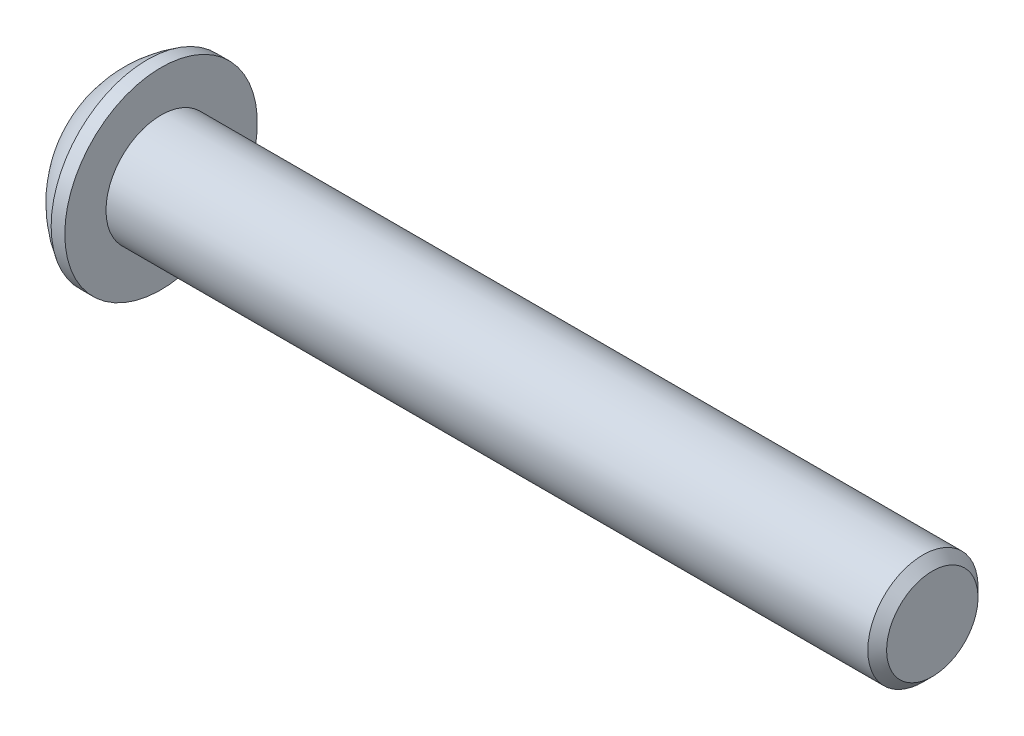
ISO-10303-21;
HEADER;
FILE_DESCRIPTION(('STEP AP214'),'2;1');
FILE_NAME('part.step','',(''),(''),'','','');
FILE_SCHEMA(('AUTOMOTIVE_DESIGN { 1 0 10303 214 1 1 1 1 }'));
ENDSEC;
DATA;
#1=APPLICATION_CONTEXT('core data for automotive mechanical design processes');
#2=APPLICATION_PROTOCOL_DEFINITION('international standard','automotive_design',2000,#1);
#3=PRODUCT_CONTEXT('',#1,'mechanical');
#4=PRODUCT('Part','Part','',(#3));
#5=PRODUCT_RELATED_PRODUCT_CATEGORY('part','',(#4));
#6=PRODUCT_DEFINITION_FORMATION('','',#4);
#7=PRODUCT_DEFINITION_CONTEXT('part definition',#1,'design');
#8=PRODUCT_DEFINITION('design','',#6,#7);
#9=PRODUCT_DEFINITION_SHAPE('','',#8);
#10=(LENGTH_UNIT() NAMED_UNIT(*) SI_UNIT(.MILLI.,.METRE.));
#11=(NAMED_UNIT(*) PLANE_ANGLE_UNIT() SI_UNIT($,.RADIAN.));
#12=(NAMED_UNIT(*) SI_UNIT($,.STERADIAN.) SOLID_ANGLE_UNIT());
#13=UNCERTAINTY_MEASURE_WITH_UNIT(LENGTH_MEASURE(1.E-05),#10,'distance_accuracy_value','');
#14=(GEOMETRIC_REPRESENTATION_CONTEXT(3) GLOBAL_UNCERTAINTY_ASSIGNED_CONTEXT((#13)) GLOBAL_UNIT_ASSIGNED_CONTEXT((#10,
#11,#12)) REPRESENTATION_CONTEXT('',''));
#15=CARTESIAN_POINT('',(0.,0.,0.));
#16=DIRECTION('',(0.,0.,1.));
#17=DIRECTION('',(1.,0.,0.));
#18=AXIS2_PLACEMENT_3D('',#15,#16,#17);
#19=CARTESIAN_POINT('',(0.,0.,0.));
#20=DIRECTION('',(-1.,0.,0.));
#21=DIRECTION('',(0.,0.,1.));
#22=AXIS2_PLACEMENT_3D('',#19,#20,#21);
#23=PLANE('',#22);
#24=CARTESIAN_POINT('',(0.,0.,0.));
#25=DIRECTION('',(-1.,0.,0.));
#26=DIRECTION('',(0.,0.,1.));
#27=AXIS2_PLACEMENT_3D('',#24,#25,#26);
#28=CIRCLE('',#27,2.77495);
#29=CARTESIAN_POINT('',(0.,2.77495,0.));
#30=VERTEX_POINT('',#29);
#31=EDGE_CURVE('E11',#30,#30,#28,.T.);
#32=ORIENTED_EDGE('',*,*,#31,.T.);
#33=EDGE_LOOP('',(#32));
#34=FACE_BOUND('',#33,.T.);
#35=DIRECTION('',(0.,-1.,0.));
#36=VECTOR('',#35,1.);
#37=CARTESIAN_POINT('',(0.,-1.14384635331849,1.9812));
#38=LINE('',#37,#36);
#39=CARTESIAN_POINT('',(0.,1.14384635331849,1.9812));
#40=VERTEX_POINT('',#39);
#41=CARTESIAN_POINT('',(0.,-1.14384635331849,1.9812));
#42=VERTEX_POINT('',#41);
#43=EDGE_CURVE('E46',#40,#42,#38,.T.);
#44=ORIENTED_EDGE('',*,*,#43,.T.);
#45=DIRECTION('',(0.,-0.5,-0.866025403784439));
#46=VECTOR('',#45,1.);
#47=CARTESIAN_POINT('',(0.,-2.28769270663697,0.));
#48=LINE('',#47,#46);
#49=CARTESIAN_POINT('',(0.,-2.28769270663697,0.));
#50=VERTEX_POINT('',#49);
#51=EDGE_CURVE('E362',#42,#50,#48,.T.);
#52=ORIENTED_EDGE('',*,*,#51,.T.);
#53=DIRECTION('',(0.,0.5,-0.866025403784439));
#54=VECTOR('',#53,1.);
#55=CARTESIAN_POINT('',(0.,-1.14384635331849,-1.9812));
#56=LINE('',#55,#54);
#57=CARTESIAN_POINT('',(0.,-1.14384635331849,-1.9812));
#58=VERTEX_POINT('',#57);
#59=EDGE_CURVE('E126',#50,#58,#56,.T.);
#60=ORIENTED_EDGE('',*,*,#59,.T.);
#61=DIRECTION('',(0.,1.,0.));
#62=VECTOR('',#61,1.);
#63=CARTESIAN_POINT('',(0.,1.14384635331849,-1.9812));
#64=LINE('',#63,#62);
#65=CARTESIAN_POINT('',(0.,1.14384635331849,-1.9812));
#66=VERTEX_POINT('',#65);
#67=EDGE_CURVE('E365',#58,#66,#64,.T.);
#68=ORIENTED_EDGE('',*,*,#67,.T.);
#69=DIRECTION('',(0.,0.5,0.866025403784439));
#70=VECTOR('',#69,1.);
#71=CARTESIAN_POINT('',(0.,2.28769270663697,0.));
#72=LINE('',#71,#70);
#73=CARTESIAN_POINT('',(0.,2.28769270663697,0.));
#74=VERTEX_POINT('',#73);
#75=EDGE_CURVE('E367',#66,#74,#72,.T.);
#76=ORIENTED_EDGE('',*,*,#75,.T.);
#77=DIRECTION('',(0.,-0.5,0.866025403784439));
#78=VECTOR('',#77,1.);
#79=CARTESIAN_POINT('',(0.,1.14384635331849,1.9812));
#80=LINE('',#79,#78);
#81=EDGE_CURVE('E369',#74,#40,#80,.T.);
#82=ORIENTED_EDGE('',*,*,#81,.T.);
#83=EDGE_LOOP('',(#44,#52,#60,#68,#76,#82));
#84=FACE_BOUND('',#83,.T.);
#85=ADVANCED_FACE('F32',(#34,#84),#23,.T.);
#86=CARTESIAN_POINT('',(5.78512506188119,0.,0.));
#87=DIRECTION('',(-1.,0.,0.));
#88=DIRECTION('',(0.,1.,0.));
#89=AXIS2_PLACEMENT_3D('',#86,#87,#88);
#90=SPHERICAL_SURFACE('',#89,6.41623094067739);
#91=CARTESIAN_POINT('',(2.5654,0.,0.));
#92=DIRECTION('',(-1.,0.,0.));
#93=DIRECTION('',(0.,0.,1.));
#94=AXIS2_PLACEMENT_3D('',#91,#92,#93);
#95=CIRCLE('',#94,5.5499);
#96=CARTESIAN_POINT('',(2.5654,5.5499,0.));
#97=VERTEX_POINT('',#96);
#98=EDGE_CURVE('E39',#97,#97,#95,.T.);
#99=CARTESIAN_POINT('',(2.5654,5.5499,0.));
#100=CARTESIAN_POINT('',(2.53083708566419,5.52984868712258,0.));
#101=CARTESIAN_POINT('',(2.49646152825914,5.50947442663449,0.));
#102=CARTESIAN_POINT('',(2.42809701945272,5.4680872977392,0.));
#103=CARTESIAN_POINT('',(2.39410806805135,5.447074429332,0.));
#104=CARTESIAN_POINT('',(2.32652866339446,5.40441737190071,0.));
#105=CARTESIAN_POINT('',(2.29293821013895,5.38277318287661,0.));
#106=CARTESIAN_POINT('',(2.22616751866502,5.33886105159856,0.));
#107=CARTESIAN_POINT('',(2.19298728044662,5.3165931093446,0.));
#108=CARTESIAN_POINT('',(2.12704860244366,5.27144124070729,0.));
#109=CARTESIAN_POINT('',(2.09429016265912,5.24855731432393,0.));
#110=CARTESIAN_POINT('',(2.02920651509859,5.20218146582175,0.));
#111=CARTESIAN_POINT('',(1.99688130732261,5.17868954370292,0.));
#112=CARTESIAN_POINT('',(1.93267540683267,5.13110590319174,0.));
#113=CARTESIAN_POINT('',(1.90079471411871,5.10701418479938,0.));
#114=CARTESIAN_POINT('',(1.83748897146475,5.05823936086598,0.));
#115=CARTESIAN_POINT('',(1.80606392152475,5.03355625532495,0.));
#116=CARTESIAN_POINT('',(1.74368043314138,4.98360727255644,0.));
#117=CARTESIAN_POINT('',(1.71272199469802,4.95834139532897,0.));
#118=CARTESIAN_POINT('',(1.65128253514951,4.90723568808467,0.));
#119=CARTESIAN_POINT('',(1.62080151404435,4.88139585806785,0.));
#120=CARTESIAN_POINT('',(1.56032752837792,4.82915126447052,0.));
#121=CARTESIAN_POINT('',(1.53033456381665,4.80274650089003,0.));
#122=CARTESIAN_POINT('',(1.4708471600897,4.74938125657909,0.));
#123=CARTESIAN_POINT('',(1.44135272092403,4.72242077584864,0.));
#124=CARTESIAN_POINT('',(1.38287266283316,4.66795350762059,0.));
#125=CARTESIAN_POINT('',(1.35388704390797,4.64044672012299,0.));
#126=CARTESIAN_POINT('',(1.29643474354244,4.58489643942841,0.));
#127=CARTESIAN_POINT('',(1.26796806210209,4.55685294623144,0.));
#128=CARTESIAN_POINT('',(1.21156357281885,4.50023904253955,0.));
#129=CARTESIAN_POINT('',(1.18362576497595,4.47166863204464,0.));
#130=CARTESIAN_POINT('',(1.12828877440023,4.41401086607543,0.));
#131=CARTESIAN_POINT('',(1.10088959166741,4.38492351060113,0.));
#132=CARTESIAN_POINT('',(1.04663941482087,4.32624200742801,0.));
#133=CARTESIAN_POINT('',(1.01978842070714,4.2966478597292,0.));
#134=CARTESIAN_POINT('',(0.966643993266069,4.2369631017545,0.));
#135=CARTESIAN_POINT('',(0.94035055993872,4.20687249147862,0.));
#136=CARTESIAN_POINT('',(0.888330431624668,4.14620531128432,0.));
#137=CARTESIAN_POINT('',(0.862603736637966,4.11562874136591,0.));
#138=CARTESIAN_POINT('',(0.811726064743087,4.05400031444217,0.));
#139=CARTESIAN_POINT('',(0.786575087834911,4.02294845743684,0.));
#140=CARTESIAN_POINT('',(0.736857630884291,3.96038029479081,0.));
#141=CARTESIAN_POINT('',(0.712291150841848,3.9288639891501,0.));
#142=CARTESIAN_POINT('',(0.6637512623949,3.8653779297977,0.));
#143=CARTESIAN_POINT('',(0.639777853990396,3.833408176086,0.));
#144=CARTESIAN_POINT('',(0.592432476584127,3.76902637942894,0.));
#145=CARTESIAN_POINT('',(0.569060507582362,3.73661433648358,0.));
#146=CARTESIAN_POINT('',(0.522926166816147,3.67135927457555,0.));
#147=CARTESIAN_POINT('',(0.500163795051696,3.63851625561289,0.));
#148=CARTESIAN_POINT('',(0.455256593824864,3.57241070531295,0.));
#149=CARTESIAN_POINT('',(0.433111764362482,3.53914817397566,0.));
#150=CARTESIAN_POINT('',(0.389447377232278,3.47221520900886,0.));
#151=CARTESIAN_POINT('',(0.367927819564456,3.43854477537934,0.));
#152=CARTESIAN_POINT('',(0.325521487354906,3.37080775824281,0.));
#153=CARTESIAN_POINT('',(0.304634712813178,3.3367411747358,0.));
#154=CARTESIAN_POINT('',(0.263501236996927,3.26822374869429,0.));
#155=CARTESIAN_POINT('',(0.243254535722403,3.23377290615979,0.));
#156=CARTESIAN_POINT('',(0.203408274368182,3.16449898643303,0.));
#157=CARTESIAN_POINT('',(0.183808714288484,3.12967590924077,0.));
#158=CARTESIAN_POINT('',(0.14526357289266,3.05966967674634,0.));
#159=CARTESIAN_POINT('',(0.126317991576534,3.02448652144419,0.));
#160=CARTESIAN_POINT('',(0.089087433723099,2.95377240655615,0.));
#161=CARTESIAN_POINT('',(0.0708024571857911,2.91824144697028,0.));
#162=CARTESIAN_POINT('',(0.0348994419493881,2.84684415010637,0.));
#163=CARTESIAN_POINT('',(0.017281403250293,2.81097781282834,0.));
#164=CARTESIAN_POINT('',(0.,2.77495,0.));
#165=B_SPLINE_CURVE_WITH_KNOTS('',3,(#99,#100,#101,#102,#103,#104,#105,#106,#107,#108,#109,#110,
#111,#112,#113,#114,#115,#116,#117,#118,#119,#120,#121,#122,#123,#124,#125,#126,#127,#128,#129,
#130,#131,#132,#133,#134,#135,#136,#137,#138,#139,#140,#141,#142,#143,#144,#145,#146,#147,#148,
#149,#150,#151,#152,#153,#154,#155,#156,#157,#158,#159,#160,#161,#162,#163,#164),.UNSPECIFIED.,
.F.,.F.,(4,2,2,2,2,2,2,2,2,2,2,2,2,2,2,2,2,2,2,2,2,2,2,2,2,2,2,2,2,2,2,2,4),(0.,
0.119872570538484,0.239745141076968,0.359617711615453,0.479490282153937,0.599362852692421,
0.719235423230905,0.83910799376939,0.958980564307873,1.07885313484636,1.19872570538484,
1.31859827592333,1.43847084646181,1.55834341700029,1.67821598753878,1.79808855807726,
1.91796112861575,2.03783369915423,2.15770626969271,2.2775788402312,2.39745141076968,
2.51732398130817,2.63719655184665,2.75706912238513,2.87694169292362,2.9968142634621,
3.11668683400059,3.23655940453907,3.35643197507756,3.47630454561604,3.59617711615452,
3.71604968669301,3.83592225723149),.UNSPECIFIED.);
#166=EDGE_CURVE('BSEAM153',#97,#30,#165,.T.);
#167=ORIENTED_EDGE('',*,*,#98,.T.);
#168=ORIENTED_EDGE('',*,*,#31,.F.);
#169=ORIENTED_EDGE('',*,*,#166,.T.);
#170=ORIENTED_EDGE('',*,*,#166,.F.);
#171=EDGE_LOOP('',(#167,#169,#168,#170));
#172=FACE_BOUND('',#171,.T.);
#173=ADVANCED_FACE('F153',(#172),#90,.T.);
#174=CARTESIAN_POINT('',(0.,0.,0.));
#175=DIRECTION('',(-1.,0.,0.));
#176=DIRECTION('',(0.,0.,1.));
#177=AXIS2_PLACEMENT_3D('',#174,#175,#176);
#178=CYLINDRICAL_SURFACE('',#177,5.5499);
#179=ORIENTED_EDGE('',*,*,#98,.F.);
#180=EDGE_LOOP('',(#179));
#181=FACE_BOUND('',#180,.T.);
#182=CARTESIAN_POINT('',(3.3528,0.,0.));
#183=DIRECTION('',(-1.,0.,0.));
#184=DIRECTION('',(0.,0.,1.));
#185=AXIS2_PLACEMENT_3D('',#182,#183,#184);
#186=CIRCLE('',#185,5.5499);
#187=CARTESIAN_POINT('',(3.3528,0.,5.5499));
#188=VERTEX_POINT('',#187);
#189=EDGE_CURVE('E148',#188,#188,#186,.T.);
#190=ORIENTED_EDGE('',*,*,#189,.T.);
#191=EDGE_LOOP('',(#190));
#192=FACE_BOUND('',#191,.T.);
#193=ADVANCED_FACE('F156',(#181,#192),#178,.T.);
#194=CARTESIAN_POINT('',(3.3528,3.17499999999999,0.));
#195=DIRECTION('',(-1.,0.,0.));
#196=DIRECTION('',(0.,0.,1.));
#197=AXIS2_PLACEMENT_3D('',#194,#195,#196);
#198=PLANE('',#197);
#199=ORIENTED_EDGE('',*,*,#189,.F.);
#200=EDGE_LOOP('',(#199));
#201=FACE_BOUND('',#200,.T.);
#202=CARTESIAN_POINT('',(3.3528,0.,0.));
#203=DIRECTION('',(-1.,0.,0.));
#204=DIRECTION('',(0.,0.,1.));
#205=AXIS2_PLACEMENT_3D('',#202,#203,#204);
#206=CIRCLE('',#205,3.17499999999999);
#207=CARTESIAN_POINT('',(3.3528,0.,3.17499999999999));
#208=VERTEX_POINT('',#207);
#209=EDGE_CURVE('E145',#208,#208,#206,.T.);
#210=ORIENTED_EDGE('',*,*,#209,.T.);
#211=EDGE_LOOP('',(#210));
#212=FACE_BOUND('',#211,.T.);
#213=ADVANCED_FACE('F159',(#201,#212),#198,.F.);
#214=CARTESIAN_POINT('',(0.,0.,0.));
#215=DIRECTION('',(-1.,0.,0.));
#216=DIRECTION('',(0.,0.,1.));
#217=AXIS2_PLACEMENT_3D('',#214,#215,#216);
#218=CYLINDRICAL_SURFACE('',#217,3.175);
#219=ORIENTED_EDGE('',*,*,#209,.F.);
#220=EDGE_LOOP('',(#219));
#221=FACE_BOUND('',#220,.T.);
#222=CARTESIAN_POINT('',(47.26178,0.,0.));
#223=DIRECTION('',(-1.,0.,0.));
#224=DIRECTION('',(0.,0.,1.));
#225=AXIS2_PLACEMENT_3D('',#222,#223,#224);
#226=CIRCLE('',#225,3.175);
#227=CARTESIAN_POINT('',(47.26178,0.,3.175));
#228=VERTEX_POINT('',#227);
#229=EDGE_CURVE('E142',#228,#228,#226,.T.);
#230=ORIENTED_EDGE('',*,*,#229,.T.);
#231=EDGE_LOOP('',(#230));
#232=FACE_BOUND('',#231,.T.);
#233=ADVANCED_FACE('F165',(#221,#232),#218,.T.);
#234=CARTESIAN_POINT('',(47.8028,0.,0.));
#235=DIRECTION('',(-1.,0.,0.));
#236=DIRECTION('',(0.,0.,1.));
#237=AXIS2_PLACEMENT_3D('',#234,#235,#236);
#238=CONICAL_SURFACE('',#237,2.63398,0.785398163397447);
#239=ORIENTED_EDGE('',*,*,#229,.F.);
#240=EDGE_LOOP('',(#239));
#241=FACE_BOUND('',#240,.T.);
#242=CARTESIAN_POINT('',(47.8028,0.,0.));
#243=DIRECTION('',(-1.,0.,0.));
#244=DIRECTION('',(0.,0.,1.));
#245=AXIS2_PLACEMENT_3D('',#242,#243,#244);
#246=CIRCLE('',#245,2.63398);
#247=CARTESIAN_POINT('',(47.8028,0.,2.63398));
#248=VERTEX_POINT('',#247);
#249=EDGE_CURVE('E138',#248,#248,#246,.T.);
#250=ORIENTED_EDGE('',*,*,#249,.T.);
#251=EDGE_LOOP('',(#250));
#252=FACE_BOUND('',#251,.T.);
#253=ADVANCED_FACE('F171',(#241,#252),#238,.T.);
#254=CARTESIAN_POINT('',(47.8028,0.,0.));
#255=DIRECTION('',(-1.,0.,0.));
#256=DIRECTION('',(0.,0.,1.));
#257=AXIS2_PLACEMENT_3D('',#254,#255,#256);
#258=PLANE('',#257);
#259=ORIENTED_EDGE('',*,*,#249,.F.);
#260=EDGE_LOOP('',(#259));
#261=FACE_BOUND('',#260,.T.);
#262=ADVANCED_FACE('F177',(#261),#258,.F.);
#263=CARTESIAN_POINT('',(2.2098,-2.28769270663697,0.));
#264=DIRECTION('',(0.,0.866025403784439,-0.5));
#265=DIRECTION('',(0.,0.5,0.866025403784439));
#266=AXIS2_PLACEMENT_3D('',#263,#264,#265);
#267=PLANE('',#266);
#268=DIRECTION('',(0.,-0.5,-0.866025403784439));
#269=VECTOR('',#268,1.);
#270=CARTESIAN_POINT('',(2.2098,-2.28769270663697,0.));
#271=LINE('',#270,#269);
#272=CARTESIAN_POINT('',(2.2098,-1.14384635331849,1.9812));
#273=VERTEX_POINT('',#272);
#274=CARTESIAN_POINT('',(2.2098,-1.71576952997773,0.9906));
#275=VERTEX_POINT('',#274);
#276=EDGE_CURVE('E112',#273,#275,#271,.T.);
#277=ORIENTED_EDGE('',*,*,#276,.T.);
#278=CARTESIAN_POINT('',(2.2098,-2.28769270663697,0.));
#279=VERTEX_POINT('',#278);
#280=EDGE_CURVE('E107',#275,#279,#271,.T.);
#281=ORIENTED_EDGE('',*,*,#280,.T.);
#282=DIRECTION('',(-1.,0.,0.));
#283=VECTOR('',#282,1.);
#284=CARTESIAN_POINT('',(2.2098,-2.28769270663697,0.));
#285=LINE('',#284,#283);
#286=EDGE_CURVE('E109',#279,#50,#285,.T.);
#287=ORIENTED_EDGE('',*,*,#286,.T.);
#288=ORIENTED_EDGE('',*,*,#51,.F.);
#289=DIRECTION('',(-1.,0.,0.));
#290=VECTOR('',#289,1.);
#291=CARTESIAN_POINT('',(2.2098,-1.14384635331849,1.9812));
#292=LINE('',#291,#290);
#293=EDGE_CURVE('E357',#273,#42,#292,.T.);
#294=ORIENTED_EDGE('',*,*,#293,.F.);
#295=EDGE_LOOP('',(#277,#281,#287,#288,#294));
#296=FACE_BOUND('',#295,.T.);
#297=ADVANCED_FACE('F108',(#296),#267,.T.);
#298=CARTESIAN_POINT('',(2.2098,-1.14384635331849,-1.9812));
#299=DIRECTION('',(0.,0.866025403784439,0.5));
#300=DIRECTION('',(0.,-0.5,0.866025403784439));
#301=AXIS2_PLACEMENT_3D('',#298,#299,#300);
#302=PLANE('',#301);
#303=DIRECTION('',(0.,0.5,-0.866025403784439));
#304=VECTOR('',#303,1.);
#305=CARTESIAN_POINT('',(2.2098,-1.14384635331849,-1.9812));
#306=LINE('',#305,#304);
#307=CARTESIAN_POINT('',(2.2098,-1.71576952997773,-0.9906));
#308=VERTEX_POINT('',#307);
#309=EDGE_CURVE('E54',#279,#308,#306,.T.);
#310=ORIENTED_EDGE('',*,*,#309,.T.);
#311=CARTESIAN_POINT('',(2.2098,-1.14384635331849,-1.9812));
#312=VERTEX_POINT('',#311);
#313=EDGE_CURVE('E121',#308,#312,#306,.T.);
#314=ORIENTED_EDGE('',*,*,#313,.T.);
#315=DIRECTION('',(-1.,0.,0.));
#316=VECTOR('',#315,1.);
#317=CARTESIAN_POINT('',(2.2098,-1.14384635331849,-1.9812));
#318=LINE('',#317,#316);
#319=EDGE_CURVE('E128',#312,#58,#318,.T.);
#320=ORIENTED_EDGE('',*,*,#319,.T.);
#321=ORIENTED_EDGE('',*,*,#59,.F.);
#322=ORIENTED_EDGE('',*,*,#286,.F.);
#323=EDGE_LOOP('',(#310,#314,#320,#321,#322));
#324=FACE_BOUND('',#323,.T.);
#325=ADVANCED_FACE('F124',(#324),#302,.T.);
#326=CARTESIAN_POINT('',(2.2098,1.14384635331849,-1.9812));
#327=DIRECTION('',(0.,0.,1.));
#328=DIRECTION('',(1.,0.,0.));
#329=AXIS2_PLACEMENT_3D('',#326,#327,#328);
#330=PLANE('',#329);
#331=DIRECTION('',(0.,1.,0.));
#332=VECTOR('',#331,1.);
#333=CARTESIAN_POINT('',(2.2098,1.14384635331849,-1.9812));
#334=LINE('',#333,#332);
#335=CARTESIAN_POINT('',(2.2098,0.,-1.9812));
#336=VERTEX_POINT('',#335);
#337=EDGE_CURVE('E387',#312,#336,#334,.T.);
#338=ORIENTED_EDGE('',*,*,#337,.T.);
#339=CARTESIAN_POINT('',(2.2098,1.14384635331849,-1.9812));
#340=VERTEX_POINT('',#339);
#341=EDGE_CURVE('E120',#336,#340,#334,.T.);
#342=ORIENTED_EDGE('',*,*,#341,.T.);
#343=DIRECTION('',(-1.,0.,0.));
#344=VECTOR('',#343,1.);
#345=CARTESIAN_POINT('',(2.2098,1.14384635331849,-1.9812));
#346=LINE('',#345,#344);
#347=EDGE_CURVE('E133',#340,#66,#346,.T.);
#348=ORIENTED_EDGE('',*,*,#347,.T.);
#349=ORIENTED_EDGE('',*,*,#67,.F.);
#350=ORIENTED_EDGE('',*,*,#319,.F.);
#351=EDGE_LOOP('',(#338,#342,#348,#349,#350));
#352=FACE_BOUND('',#351,.T.);
#353=ADVANCED_FACE('F236',(#352),#330,.T.);
#354=CARTESIAN_POINT('',(2.2098,2.28769270663697,0.));
#355=DIRECTION('',(0.,-0.866025403784439,0.5));
#356=DIRECTION('',(0.,-0.5,-0.866025403784439));
#357=AXIS2_PLACEMENT_3D('',#354,#355,#356);
#358=PLANE('',#357);
#359=DIRECTION('',(0.,0.5,0.866025403784439));
#360=VECTOR('',#359,1.);
#361=CARTESIAN_POINT('',(2.2098,2.28769270663697,0.));
#362=LINE('',#361,#360);
#363=CARTESIAN_POINT('',(2.2098,1.71576952997773,-0.990600000000001));
#364=VERTEX_POINT('',#363);
#365=EDGE_CURVE('E391',#340,#364,#362,.T.);
#366=ORIENTED_EDGE('',*,*,#365,.T.);
#367=CARTESIAN_POINT('',(2.2098,2.28769270663697,0.));
#368=VERTEX_POINT('',#367);
#369=EDGE_CURVE('E389',#364,#368,#362,.T.);
#370=ORIENTED_EDGE('',*,*,#369,.T.);
#371=DIRECTION('',(-1.,0.,0.));
#372=VECTOR('',#371,1.);
#373=CARTESIAN_POINT('',(2.2098,2.28769270663697,0.));
#374=LINE('',#373,#372);
#375=EDGE_CURVE('E373',#368,#74,#374,.T.);
#376=ORIENTED_EDGE('',*,*,#375,.T.);
#377=ORIENTED_EDGE('',*,*,#75,.F.);
#378=ORIENTED_EDGE('',*,*,#347,.F.);
#379=EDGE_LOOP('',(#366,#370,#376,#377,#378));
#380=FACE_BOUND('',#379,.T.);
#381=ADVANCED_FACE('F245',(#380),#358,.T.);
#382=CARTESIAN_POINT('',(2.2098,1.14384635331849,1.9812));
#383=DIRECTION('',(0.,-0.866025403784439,-0.5));
#384=DIRECTION('',(0.,0.5,-0.866025403784439));
#385=AXIS2_PLACEMENT_3D('',#382,#383,#384);
#386=PLANE('',#385);
#387=DIRECTION('',(0.,-0.5,0.866025403784439));
#388=VECTOR('',#387,1.);
#389=CARTESIAN_POINT('',(2.2098,1.14384635331849,1.9812));
#390=LINE('',#389,#388);
#391=CARTESIAN_POINT('',(2.2098,1.71576952997773,0.990600000000001));
#392=VERTEX_POINT('',#391);
#393=EDGE_CURVE('E352',#368,#392,#390,.T.);
#394=ORIENTED_EDGE('',*,*,#393,.T.);
#395=CARTESIAN_POINT('',(2.2098,1.14384635331849,1.9812));
#396=VERTEX_POINT('',#395);
#397=EDGE_CURVE('E348',#392,#396,#390,.T.);
#398=ORIENTED_EDGE('',*,*,#397,.T.);
#399=DIRECTION('',(-1.,0.,0.));
#400=VECTOR('',#399,1.);
#401=CARTESIAN_POINT('',(2.2098,1.14384635331849,1.9812));
#402=LINE('',#401,#400);
#403=EDGE_CURVE('E356',#396,#40,#402,.T.);
#404=ORIENTED_EDGE('',*,*,#403,.T.);
#405=ORIENTED_EDGE('',*,*,#81,.F.);
#406=ORIENTED_EDGE('',*,*,#375,.F.);
#407=EDGE_LOOP('',(#394,#398,#404,#405,#406));
#408=FACE_BOUND('',#407,.T.);
#409=ADVANCED_FACE('F255',(#408),#386,.T.);
#410=CARTESIAN_POINT('',(2.2098,-1.14384635331849,1.9812));
#411=DIRECTION('',(0.,0.,-1.));
#412=DIRECTION('',(0.,1.,0.));
#413=AXIS2_PLACEMENT_3D('',#410,#411,#412);
#414=PLANE('',#413);
#415=DIRECTION('',(0.,-1.,0.));
#416=VECTOR('',#415,1.);
#417=CARTESIAN_POINT('',(2.2098,-1.14384635331849,1.9812));
#418=LINE('',#417,#416);
#419=CARTESIAN_POINT('',(2.2098,0.,1.9812));
#420=VERTEX_POINT('',#419);
#421=EDGE_CURVE('E347',#396,#420,#418,.T.);
#422=ORIENTED_EDGE('',*,*,#421,.T.);
#423=EDGE_CURVE('E350',#420,#273,#418,.T.);
#424=ORIENTED_EDGE('',*,*,#423,.T.);
#425=ORIENTED_EDGE('',*,*,#293,.T.);
#426=ORIENTED_EDGE('',*,*,#43,.F.);
#427=ORIENTED_EDGE('',*,*,#403,.F.);
#428=EDGE_LOOP('',(#422,#424,#425,#426,#427));
#429=FACE_BOUND('',#428,.T.);
#430=ADVANCED_FACE('F265',(#429),#414,.T.);
#431=CARTESIAN_POINT('',(2.2098,-2.28769270663697,0.));
#432=DIRECTION('',(1.,0.,0.));
#433=DIRECTION('',(0.,0.,-1.));
#434=AXIS2_PLACEMENT_3D('',#431,#432,#433);
#435=PLANE('',#434);
#436=CARTESIAN_POINT('',(2.2098,0.,0.));
#437=DIRECTION('',(-1.,0.,0.));
#438=DIRECTION('',(0.,0.,1.));
#439=AXIS2_PLACEMENT_3D('',#436,#437,#438);
#440=CIRCLE('',#439,1.9812);
#441=EDGE_CURVE('E394',#364,#336,#440,.T.);
#442=ORIENTED_EDGE('',*,*,#441,.F.);
#443=ORIENTED_EDGE('',*,*,#365,.F.);
#444=ORIENTED_EDGE('',*,*,#341,.F.);
#445=EDGE_LOOP('',(#442,#443,#444));
#446=FACE_BOUND('',#445,.T.);
#447=ADVANCED_FACE('F275',(#446),#435,.F.);
#448=EDGE_CURVE('E139',#392,#364,#440,.T.);
#449=ORIENTED_EDGE('',*,*,#448,.F.);
#450=ORIENTED_EDGE('',*,*,#393,.F.);
#451=ORIENTED_EDGE('',*,*,#369,.F.);
#452=EDGE_LOOP('',(#449,#450,#451));
#453=FACE_BOUND('',#452,.T.);
#454=ADVANCED_FACE('F285',(#453),#435,.F.);
#455=EDGE_CURVE('E132',#420,#392,#440,.T.);
#456=ORIENTED_EDGE('',*,*,#455,.F.);
#457=ORIENTED_EDGE('',*,*,#421,.F.);
#458=ORIENTED_EDGE('',*,*,#397,.F.);
#459=EDGE_LOOP('',(#456,#457,#458));
#460=FACE_BOUND('',#459,.T.);
#461=ADVANCED_FACE('F296',(#460),#435,.F.);
#462=EDGE_CURVE('E127',#275,#420,#440,.T.);
#463=ORIENTED_EDGE('',*,*,#462,.F.);
#464=ORIENTED_EDGE('',*,*,#276,.F.);
#465=ORIENTED_EDGE('',*,*,#423,.F.);
#466=EDGE_LOOP('',(#463,#464,#465));
#467=FACE_BOUND('',#466,.T.);
#468=ADVANCED_FACE('F305',(#467),#435,.F.);
#469=EDGE_CURVE('E118',#308,#275,#440,.T.);
#470=ORIENTED_EDGE('',*,*,#469,.F.);
#471=ORIENTED_EDGE('',*,*,#309,.F.);
#472=ORIENTED_EDGE('',*,*,#280,.F.);
#473=EDGE_LOOP('',(#470,#471,#472));
#474=FACE_BOUND('',#473,.T.);
#475=ADVANCED_FACE('F117',(#474),#435,.F.);
#476=EDGE_CURVE('E388',#336,#308,#440,.T.);
#477=ORIENTED_EDGE('',*,*,#476,.F.);
#478=ORIENTED_EDGE('',*,*,#337,.F.);
#479=ORIENTED_EDGE('',*,*,#313,.F.);
#480=EDGE_LOOP('',(#477,#478,#479));
#481=FACE_BOUND('',#480,.T.);
#482=ADVANCED_FACE('F288',(#481),#435,.F.);
#483=CARTESIAN_POINT('',(3.3536463533185,0.,0.));
#484=DIRECTION('',(-1.,0.,0.));
#485=DIRECTION('',(0.,0.,1.));
#486=AXIS2_PLACEMENT_3D('',#483,#484,#485);
#487=CONICAL_SURFACE('',#486,0.,1.04719755119659);
#488=ORIENTED_EDGE('',*,*,#455,.T.);
#489=ORIENTED_EDGE('',*,*,#448,.T.);
#490=ORIENTED_EDGE('',*,*,#441,.T.);
#491=ORIENTED_EDGE('',*,*,#476,.T.);
#492=ORIENTED_EDGE('',*,*,#469,.T.);
#493=ORIENTED_EDGE('',*,*,#462,.T.);
#494=EDGE_LOOP('',(#488,#489,#490,#491,#492,#493));
#495=FACE_BOUND('',#494,.T.);
#496=CARTESIAN_POINT('',(3.3536463533185,0.,0.));
#497=VERTEX_POINT('',#496);
#498=VERTEX_LOOP('',#497);
#499=FACE_BOUND('',#498,.T.);
#500=ADVANCED_FACE('F329',(#495,#499),#487,.F.);
#501=CLOSED_SHELL('',(#85,#173,#193,#213,#233,#253,#262,#297,#325,#353,#381,#409,#430,#447,#454,
#461,#468,#475,#482,#500));
#502=MANIFOLD_SOLID_BREP('B2',#501);
#503=ADVANCED_BREP_SHAPE_REPRESENTATION('',(#18,#502),#14);
#504=SHAPE_DEFINITION_REPRESENTATION(#9,#503);
ENDSEC;
END-ISO-10303-21;
